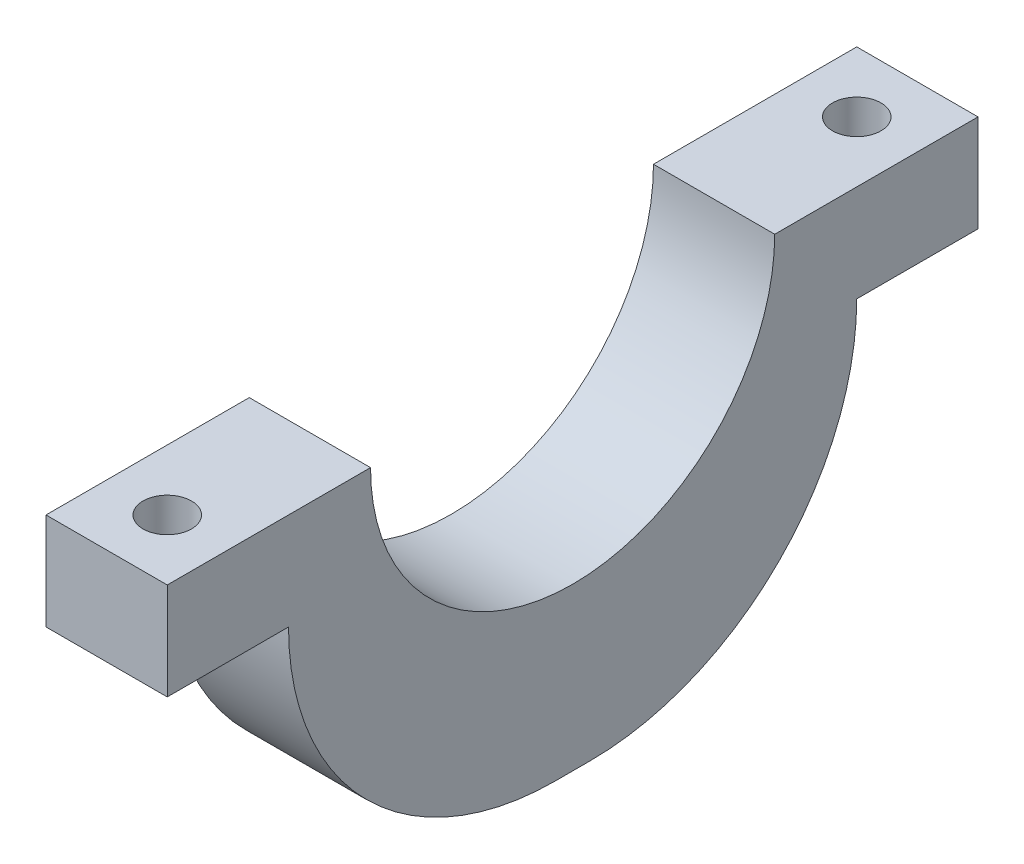
ISO-10303-21;
HEADER;
FILE_DESCRIPTION(('STEP AP214'),'2;1');
FILE_NAME('part.step','',(''),(''),'','','');
FILE_SCHEMA(('AUTOMOTIVE_DESIGN { 1 0 10303 214 1 1 1 1 }'));
ENDSEC;
DATA;
#1=APPLICATION_CONTEXT('core data for automotive mechanical design processes');
#2=APPLICATION_PROTOCOL_DEFINITION('international standard','automotive_design',2000,#1);
#3=PRODUCT_CONTEXT('',#1,'mechanical');
#4=PRODUCT('Part','Part','',(#3));
#5=PRODUCT_RELATED_PRODUCT_CATEGORY('part','',(#4));
#6=PRODUCT_DEFINITION_FORMATION('','',#4);
#7=PRODUCT_DEFINITION_CONTEXT('part definition',#1,'design');
#8=PRODUCT_DEFINITION('design','',#6,#7);
#9=PRODUCT_DEFINITION_SHAPE('','',#8);
#10=(LENGTH_UNIT() NAMED_UNIT(*) SI_UNIT(.MILLI.,.METRE.));
#11=(NAMED_UNIT(*) PLANE_ANGLE_UNIT() SI_UNIT($,.RADIAN.));
#12=(NAMED_UNIT(*) SI_UNIT($,.STERADIAN.) SOLID_ANGLE_UNIT());
#13=UNCERTAINTY_MEASURE_WITH_UNIT(LENGTH_MEASURE(1.E-05),#10,'distance_accuracy_value','');
#14=(GEOMETRIC_REPRESENTATION_CONTEXT(3) GLOBAL_UNCERTAINTY_ASSIGNED_CONTEXT((#13)) GLOBAL_UNIT_ASSIGNED_CONTEXT((#10,
#11,#12)) REPRESENTATION_CONTEXT('',''));
#15=CARTESIAN_POINT('',(0.,0.,0.));
#16=DIRECTION('',(0.,0.,1.));
#17=DIRECTION('',(1.,0.,0.));
#18=AXIS2_PLACEMENT_3D('',#15,#16,#17);
#19=CARTESIAN_POINT('',(0.,58.75,62.0524601018634));
#20=DIRECTION('',(1.,0.,0.));
#21=DIRECTION('',(0.,0.,-1.));
#22=AXIS2_PLACEMENT_3D('',#19,#20,#21);
#23=CYLINDRICAL_SURFACE('',#22,16.5);
#24=DIRECTION('',(1.,0.,0.));
#25=VECTOR('',#24,1.);
#26=CARTESIAN_POINT('',(0.,42.25,62.0524601018634));
#27=LINE('',#26,#25);
#28=CARTESIAN_POINT('',(-65.925,42.25,62.0524601018634));
#29=VERTEX_POINT('',#28);
#30=CARTESIAN_POINT('',(-58.425,42.25,62.0524601018634));
#31=VERTEX_POINT('',#30);
#32=EDGE_CURVE('E153',#29,#31,#27,.T.);
#33=ORIENTED_EDGE('',*,*,#32,.F.);
#34=CARTESIAN_POINT('',(-65.925,58.75,62.0524601018634));
#35=DIRECTION('',(-1.,0.,0.));
#36=DIRECTION('',(0.,0.,1.));
#37=AXIS2_PLACEMENT_3D('',#34,#35,#36);
#38=CIRCLE('',#37,16.5);
#39=CARTESIAN_POINT('',(-65.925,58.75,45.5524601018634));
#40=VERTEX_POINT('',#39);
#41=EDGE_CURVE('E43',#40,#29,#38,.T.);
#42=ORIENTED_EDGE('',*,*,#41,.F.);
#43=DIRECTION('',(1.,0.,0.));
#44=VECTOR('',#43,1.);
#45=CARTESIAN_POINT('',(0.,58.75,45.5524601018634));
#46=LINE('',#45,#44);
#47=CARTESIAN_POINT('',(-58.425,58.75,45.5524601018634));
#48=VERTEX_POINT('',#47);
#49=EDGE_CURVE('E117',#40,#48,#46,.T.);
#50=ORIENTED_EDGE('',*,*,#49,.T.);
#51=CARTESIAN_POINT('',(-58.425,58.75,62.0524601018634));
#52=DIRECTION('',(-1.,0.,0.));
#53=DIRECTION('',(0.,0.,1.));
#54=AXIS2_PLACEMENT_3D('',#51,#52,#53);
#55=CIRCLE('',#54,16.5);
#56=EDGE_CURVE('E11',#31,#48,#55,.F.);
#57=ORIENTED_EDGE('',*,*,#56,.F.);
#58=EDGE_LOOP('',(#33,#42,#50,#57));
#59=FACE_BOUND('',#58,.T.);
#60=ADVANCED_FACE('F36',(#59),#23,.T.);
#61=CARTESIAN_POINT('',(-65.925,58.75,64.1975398981366));
#62=DIRECTION('',(-1.,0.,0.));
#63=DIRECTION('',(0.,0.,1.));
#64=AXIS2_PLACEMENT_3D('',#61,#62,#63);
#65=CYLINDRICAL_SURFACE('',#64,16.5);
#66=DIRECTION('',(1.,0.,0.));
#67=VECTOR('',#66,1.);
#68=CARTESIAN_POINT('',(0.,58.75,80.6975398981366));
#69=LINE('',#68,#67);
#70=CARTESIAN_POINT('',(-65.925,58.75,80.6975398981366));
#71=VERTEX_POINT('',#70);
#72=CARTESIAN_POINT('',(-58.425,58.75,80.6975398981366));
#73=VERTEX_POINT('',#72);
#74=EDGE_CURVE('E169',#71,#73,#69,.T.);
#75=ORIENTED_EDGE('',*,*,#74,.F.);
#76=CARTESIAN_POINT('',(-65.925,58.75,64.1975398981366));
#77=DIRECTION('',(-1.,0.,0.));
#78=DIRECTION('',(0.,0.,1.));
#79=AXIS2_PLACEMENT_3D('',#76,#77,#78);
#80=CIRCLE('',#79,16.5);
#81=CARTESIAN_POINT('',(-65.925,42.25,64.1975398981366));
#82=VERTEX_POINT('',#81);
#83=EDGE_CURVE('E149',#82,#71,#80,.T.);
#84=ORIENTED_EDGE('',*,*,#83,.F.);
#85=DIRECTION('',(1.,0.,0.));
#86=VECTOR('',#85,1.);
#87=CARTESIAN_POINT('',(-65.925,42.25,64.1975398981366));
#88=LINE('',#87,#86);
#89=CARTESIAN_POINT('',(-58.425,42.25,64.1975398981366));
#90=VERTEX_POINT('',#89);
#91=EDGE_CURVE('E146',#90,#82,#88,.F.);
#92=ORIENTED_EDGE('',*,*,#91,.F.);
#93=CARTESIAN_POINT('',(-58.425,58.75,64.1975398981366));
#94=DIRECTION('',(-1.,0.,0.));
#95=DIRECTION('',(0.,0.,1.));
#96=AXIS2_PLACEMENT_3D('',#93,#94,#95);
#97=CIRCLE('',#96,16.5);
#98=EDGE_CURVE('E151',#73,#90,#97,.F.);
#99=ORIENTED_EDGE('',*,*,#98,.F.);
#100=EDGE_LOOP('',(#75,#84,#92,#99));
#101=FACE_BOUND('',#100,.T.);
#102=ADVANCED_FACE('F175',(#101),#65,.T.);
#103=CARTESIAN_POINT('',(-62.175,64.75,41.8024601018634));
#104=DIRECTION('',(0.,-1.,0.));
#105=DIRECTION('',(0.,0.,-1.));
#106=AXIS2_PLACEMENT_3D('',#103,#104,#105);
#107=CYLINDRICAL_SURFACE('',#106,1.5);
#108=CARTESIAN_POINT('',(-62.175,64.75,41.8024601018634));
#109=DIRECTION('',(0.,1.,0.));
#110=DIRECTION('',(0.,0.,1.));
#111=AXIS2_PLACEMENT_3D('',#108,#109,#110);
#112=CIRCLE('',#111,1.5);
#113=CARTESIAN_POINT('',(-62.175,64.75,43.3024601018634));
#114=VERTEX_POINT('',#113);
#115=EDGE_CURVE('E138',#114,#114,#112,.T.);
#116=ORIENTED_EDGE('',*,*,#115,.T.);
#117=EDGE_LOOP('',(#116));
#118=FACE_BOUND('',#117,.T.);
#119=CARTESIAN_POINT('',(-62.175,58.75,41.8024601018634));
#120=DIRECTION('',(0.,1.,0.));
#121=DIRECTION('',(0.,0.,1.));
#122=AXIS2_PLACEMENT_3D('',#119,#120,#121);
#123=CIRCLE('',#122,1.5);
#124=CARTESIAN_POINT('',(-62.175,58.75,43.3024601018634));
#125=VERTEX_POINT('',#124);
#126=EDGE_CURVE('E130',#125,#125,#123,.T.);
#127=ORIENTED_EDGE('',*,*,#126,.F.);
#128=EDGE_LOOP('',(#127));
#129=FACE_BOUND('',#128,.T.);
#130=ADVANCED_FACE('F247',(#118,#129),#107,.F.);
#131=CARTESIAN_POINT('',(-62.175,64.75,84.4475398981366));
#132=DIRECTION('',(0.,-1.,0.));
#133=DIRECTION('',(0.,0.,-1.));
#134=AXIS2_PLACEMENT_3D('',#131,#132,#133);
#135=CYLINDRICAL_SURFACE('',#134,1.5);
#136=CARTESIAN_POINT('',(-62.175,64.75,84.4475398981366));
#137=DIRECTION('',(0.,-1.,0.));
#138=DIRECTION('',(0.,0.,-1.));
#139=AXIS2_PLACEMENT_3D('',#136,#137,#138);
#140=CIRCLE('',#139,1.5);
#141=CARTESIAN_POINT('',(-62.175,64.75,82.9475398981366));
#142=VERTEX_POINT('',#141);
#143=EDGE_CURVE('E188',#142,#142,#140,.T.);
#144=ORIENTED_EDGE('',*,*,#143,.F.);
#145=EDGE_LOOP('',(#144));
#146=FACE_BOUND('',#145,.T.);
#147=CARTESIAN_POINT('',(-62.175,58.75,84.4475398981366));
#148=DIRECTION('',(0.,-1.,0.));
#149=DIRECTION('',(0.,0.,-1.));
#150=AXIS2_PLACEMENT_3D('',#147,#148,#149);
#151=CIRCLE('',#150,1.5);
#152=CARTESIAN_POINT('',(-62.175,58.75,82.9475398981366));
#153=VERTEX_POINT('',#152);
#154=EDGE_CURVE('E137',#153,#153,#151,.T.);
#155=ORIENTED_EDGE('',*,*,#154,.T.);
#156=EDGE_LOOP('',(#155));
#157=FACE_BOUND('',#156,.T.);
#158=ADVANCED_FACE('F239',(#146,#157),#135,.F.);
#159=CARTESIAN_POINT('',(0.,58.75,126.25));
#160=DIRECTION('',(0.,1.,0.));
#161=DIRECTION('',(0.,0.,-1.));
#162=AXIS2_PLACEMENT_3D('',#159,#160,#161);
#163=PLANE('',#162);
#164=ORIENTED_EDGE('',*,*,#126,.T.);
#165=EDGE_LOOP('',(#164));
#166=FACE_BOUND('',#165,.T.);
#167=DIRECTION('',(1.,0.,0.));
#168=VECTOR('',#167,1.);
#169=CARTESIAN_POINT('',(0.,58.75,38.0524601018634));
#170=LINE('',#169,#168);
#171=CARTESIAN_POINT('',(-65.925,58.75,38.0524601018634));
#172=VERTEX_POINT('',#171);
#173=CARTESIAN_POINT('',(-58.425,58.75,38.0524601018634));
#174=VERTEX_POINT('',#173);
#175=EDGE_CURVE('E124',#172,#174,#170,.T.);
#176=ORIENTED_EDGE('',*,*,#175,.T.);
#177=DIRECTION('',(0.,0.,1.));
#178=VECTOR('',#177,1.);
#179=CARTESIAN_POINT('',(-58.425,58.75,126.25));
#180=LINE('',#179,#178);
#181=EDGE_CURVE('E112',#174,#48,#180,.T.);
#182=ORIENTED_EDGE('',*,*,#181,.T.);
#183=ORIENTED_EDGE('',*,*,#49,.F.);
#184=DIRECTION('',(0.,0.,-1.));
#185=VECTOR('',#184,1.);
#186=CARTESIAN_POINT('',(-65.925,58.75,126.25));
#187=LINE('',#186,#185);
#188=EDGE_CURVE('E126',#40,#172,#187,.T.);
#189=ORIENTED_EDGE('',*,*,#188,.T.);
#190=EDGE_LOOP('',(#176,#182,#183,#189));
#191=FACE_BOUND('',#190,.T.);
#192=ADVANCED_FACE('F122',(#166,#191),#163,.F.);
#193=CARTESIAN_POINT('',(0.,58.75,38.0524601018634));
#194=DIRECTION('',(0.,0.,1.));
#195=DIRECTION('',(1.,0.,0.));
#196=AXIS2_PLACEMENT_3D('',#193,#194,#195);
#197=PLANE('',#196);
#198=DIRECTION('',(1.,0.,0.));
#199=VECTOR('',#198,1.);
#200=CARTESIAN_POINT('',(0.,64.75,38.0524601018634));
#201=LINE('',#200,#199);
#202=CARTESIAN_POINT('',(-65.925,64.75,38.0524601018634));
#203=VERTEX_POINT('',#202);
#204=CARTESIAN_POINT('',(-58.425,64.75,38.0524601018634));
#205=VERTEX_POINT('',#204);
#206=EDGE_CURVE('E128',#203,#205,#201,.T.);
#207=ORIENTED_EDGE('',*,*,#206,.T.);
#208=DIRECTION('',(0.,1.,0.));
#209=VECTOR('',#208,1.);
#210=CARTESIAN_POINT('',(-58.425,58.75,38.0524601018634));
#211=LINE('',#210,#209);
#212=EDGE_CURVE('E142',#174,#205,#211,.T.);
#213=ORIENTED_EDGE('',*,*,#212,.F.);
#214=ORIENTED_EDGE('',*,*,#175,.F.);
#215=DIRECTION('',(0.,1.,0.));
#216=VECTOR('',#215,1.);
#217=CARTESIAN_POINT('',(-65.925,58.75,38.0524601018634));
#218=LINE('',#217,#216);
#219=EDGE_CURVE('E193',#172,#203,#218,.T.);
#220=ORIENTED_EDGE('',*,*,#219,.T.);
#221=EDGE_LOOP('',(#207,#213,#214,#220));
#222=FACE_BOUND('',#221,.T.);
#223=ADVANCED_FACE('F230',(#222),#197,.F.);
#224=CARTESIAN_POINT('',(0.,64.75,0.));
#225=DIRECTION('',(0.,-1.,0.));
#226=DIRECTION('',(0.,0.,1.));
#227=AXIS2_PLACEMENT_3D('',#224,#225,#226);
#228=PLANE('',#227);
#229=ORIENTED_EDGE('',*,*,#115,.F.);
#230=EDGE_LOOP('',(#229));
#231=FACE_BOUND('',#230,.T.);
#232=DIRECTION('',(0.,0.,-1.));
#233=VECTOR('',#232,1.);
#234=CARTESIAN_POINT('',(-58.425,64.75,53.125));
#235=LINE('',#234,#233);
#236=CARTESIAN_POINT('',(-58.425,64.75,50.625));
#237=VERTEX_POINT('',#236);
#238=EDGE_CURVE('E195',#237,#205,#235,.T.);
#239=ORIENTED_EDGE('',*,*,#238,.T.);
#240=ORIENTED_EDGE('',*,*,#206,.F.);
#241=DIRECTION('',(0.,0.,1.));
#242=VECTOR('',#241,1.);
#243=CARTESIAN_POINT('',(-65.925,64.75,53.125));
#244=LINE('',#243,#242);
#245=CARTESIAN_POINT('',(-65.925,64.75,50.625));
#246=VERTEX_POINT('',#245);
#247=EDGE_CURVE('E205',#203,#246,#244,.T.);
#248=ORIENTED_EDGE('',*,*,#247,.T.);
#249=DIRECTION('',(1.,0.,0.));
#250=VECTOR('',#249,1.);
#251=CARTESIAN_POINT('',(-70.925,64.75,50.625));
#252=LINE('',#251,#250);
#253=EDGE_CURVE('E192',#237,#246,#252,.F.);
#254=ORIENTED_EDGE('',*,*,#253,.F.);
#255=EDGE_LOOP('',(#239,#240,#248,#254));
#256=FACE_BOUND('',#255,.T.);
#257=ADVANCED_FACE('F226',(#231,#256),#228,.F.);
#258=CARTESIAN_POINT('',(-70.925,64.75,63.125));
#259=DIRECTION('',(1.,0.,0.));
#260=DIRECTION('',(0.,0.,-1.));
#261=AXIS2_PLACEMENT_3D('',#258,#259,#260);
#262=CYLINDRICAL_SURFACE('',#261,12.5);
#263=DIRECTION('',(1.,0.,0.));
#264=VECTOR('',#263,1.);
#265=CARTESIAN_POINT('',(-70.925,64.75,75.625));
#266=LINE('',#265,#264);
#267=CARTESIAN_POINT('',(-65.925,64.75,75.625));
#268=VERTEX_POINT('',#267);
#269=CARTESIAN_POINT('',(-58.425,64.75,75.625));
#270=VERTEX_POINT('',#269);
#271=EDGE_CURVE('E208',#268,#270,#266,.T.);
#272=ORIENTED_EDGE('',*,*,#271,.T.);
#273=CARTESIAN_POINT('',(-58.425,64.75,63.125));
#274=DIRECTION('',(-1.,0.,0.));
#275=DIRECTION('',(0.,0.,1.));
#276=AXIS2_PLACEMENT_3D('',#273,#274,#275);
#277=CIRCLE('',#276,12.5);
#278=EDGE_CURVE('E183',#237,#270,#277,.T.);
#279=ORIENTED_EDGE('',*,*,#278,.F.);
#280=ORIENTED_EDGE('',*,*,#253,.T.);
#281=CARTESIAN_POINT('',(-65.925,64.75,63.125));
#282=DIRECTION('',(-1.,0.,0.));
#283=DIRECTION('',(0.,0.,1.));
#284=AXIS2_PLACEMENT_3D('',#281,#282,#283);
#285=CIRCLE('',#284,12.5);
#286=EDGE_CURVE('E143',#268,#246,#285,.F.);
#287=ORIENTED_EDGE('',*,*,#286,.F.);
#288=EDGE_LOOP('',(#272,#279,#280,#287));
#289=FACE_BOUND('',#288,.T.);
#290=ADVANCED_FACE('F224',(#289),#262,.F.);
#291=ORIENTED_EDGE('',*,*,#143,.T.);
#292=EDGE_LOOP('',(#291));
#293=FACE_BOUND('',#292,.T.);
#294=DIRECTION('',(0.,0.,1.));
#295=VECTOR('',#294,1.);
#296=CARTESIAN_POINT('',(-65.925,64.75,73.125));
#297=LINE('',#296,#295);
#298=CARTESIAN_POINT('',(-65.925,64.75,88.1975398981366));
#299=VERTEX_POINT('',#298);
#300=EDGE_CURVE('E191',#268,#299,#297,.T.);
#301=ORIENTED_EDGE('',*,*,#300,.T.);
#302=DIRECTION('',(1.,0.,0.));
#303=VECTOR('',#302,1.);
#304=CARTESIAN_POINT('',(0.,64.75,88.1975398981366));
#305=LINE('',#304,#303);
#306=CARTESIAN_POINT('',(-58.425,64.75,88.1975398981366));
#307=VERTEX_POINT('',#306);
#308=EDGE_CURVE('E204',#299,#307,#305,.T.);
#309=ORIENTED_EDGE('',*,*,#308,.T.);
#310=DIRECTION('',(0.,0.,-1.));
#311=VECTOR('',#310,1.);
#312=CARTESIAN_POINT('',(-58.425,64.75,73.125));
#313=LINE('',#312,#311);
#314=EDGE_CURVE('E185',#307,#270,#313,.T.);
#315=ORIENTED_EDGE('',*,*,#314,.T.);
#316=ORIENTED_EDGE('',*,*,#271,.F.);
#317=EDGE_LOOP('',(#301,#309,#315,#316));
#318=FACE_BOUND('',#317,.T.);
#319=ADVANCED_FACE('F214',(#293,#318),#228,.F.);
#320=CARTESIAN_POINT('',(0.,58.75,88.1975398981366));
#321=DIRECTION('',(0.,0.,1.));
#322=DIRECTION('',(1.,0.,0.));
#323=AXIS2_PLACEMENT_3D('',#320,#321,#322);
#324=PLANE('',#323);
#325=ORIENTED_EDGE('',*,*,#308,.F.);
#326=DIRECTION('',(0.,1.,0.));
#327=VECTOR('',#326,1.);
#328=CARTESIAN_POINT('',(-65.925,58.75,88.1975398981366));
#329=LINE('',#328,#327);
#330=CARTESIAN_POINT('',(-65.925,58.75,88.1975398981366));
#331=VERTEX_POINT('',#330);
#332=EDGE_CURVE('E173',#331,#299,#329,.T.);
#333=ORIENTED_EDGE('',*,*,#332,.F.);
#334=DIRECTION('',(1.,0.,0.));
#335=VECTOR('',#334,1.);
#336=CARTESIAN_POINT('',(0.,58.75,88.1975398981366));
#337=LINE('',#336,#335);
#338=CARTESIAN_POINT('',(-58.425,58.75,88.1975398981366));
#339=VERTEX_POINT('',#338);
#340=EDGE_CURVE('E172',#331,#339,#337,.T.);
#341=ORIENTED_EDGE('',*,*,#340,.T.);
#342=DIRECTION('',(0.,1.,0.));
#343=VECTOR('',#342,1.);
#344=CARTESIAN_POINT('',(-58.425,58.75,88.1975398981366));
#345=LINE('',#344,#343);
#346=EDGE_CURVE('E176',#339,#307,#345,.T.);
#347=ORIENTED_EDGE('',*,*,#346,.T.);
#348=EDGE_LOOP('',(#325,#333,#341,#347));
#349=FACE_BOUND('',#348,.T.);
#350=ADVANCED_FACE('F219',(#349),#324,.T.);
#351=CARTESIAN_POINT('',(0.,58.75,0.));
#352=DIRECTION('',(0.,1.,0.));
#353=DIRECTION('',(0.,0.,1.));
#354=AXIS2_PLACEMENT_3D('',#351,#352,#353);
#355=PLANE('',#354);
#356=ORIENTED_EDGE('',*,*,#154,.F.);
#357=EDGE_LOOP('',(#356));
#358=FACE_BOUND('',#357,.T.);
#359=ORIENTED_EDGE('',*,*,#340,.F.);
#360=DIRECTION('',(0.,0.,1.));
#361=VECTOR('',#360,1.);
#362=CARTESIAN_POINT('',(-65.925,58.75,0.));
#363=LINE('',#362,#361);
#364=EDGE_CURVE('E161',#71,#331,#363,.T.);
#365=ORIENTED_EDGE('',*,*,#364,.F.);
#366=ORIENTED_EDGE('',*,*,#74,.T.);
#367=DIRECTION('',(0.,0.,-1.));
#368=VECTOR('',#367,1.);
#369=CARTESIAN_POINT('',(-58.425,58.75,0.));
#370=LINE('',#369,#368);
#371=EDGE_CURVE('E120',#339,#73,#370,.T.);
#372=ORIENTED_EDGE('',*,*,#371,.F.);
#373=EDGE_LOOP('',(#359,#365,#366,#372));
#374=FACE_BOUND('',#373,.T.);
#375=ADVANCED_FACE('F167',(#358,#374),#355,.F.);
#376=CARTESIAN_POINT('',(-65.925,-35.9364248901641,45.5524601018634));
#377=DIRECTION('',(-1.,0.,0.));
#378=DIRECTION('',(0.,0.,1.));
#379=AXIS2_PLACEMENT_3D('',#376,#377,#378);
#380=PLANE('',#379);
#381=ORIENTED_EDGE('',*,*,#188,.F.);
#382=ORIENTED_EDGE('',*,*,#41,.T.);
#383=DIRECTION('',(0.,0.,-1.));
#384=VECTOR('',#383,1.);
#385=CARTESIAN_POINT('',(-65.925,42.25,45.5524601018634));
#386=LINE('',#385,#384);
#387=EDGE_CURVE('E119',#82,#29,#386,.T.);
#388=ORIENTED_EDGE('',*,*,#387,.F.);
#389=ORIENTED_EDGE('',*,*,#83,.T.);
#390=ORIENTED_EDGE('',*,*,#364,.T.);
#391=ORIENTED_EDGE('',*,*,#332,.T.);
#392=ORIENTED_EDGE('',*,*,#300,.F.);
#393=ORIENTED_EDGE('',*,*,#286,.T.);
#394=ORIENTED_EDGE('',*,*,#247,.F.);
#395=ORIENTED_EDGE('',*,*,#219,.F.);
#396=EDGE_LOOP('',(#381,#382,#388,#389,#390,#391,#392,#393,#394,#395));
#397=FACE_BOUND('',#396,.T.);
#398=ADVANCED_FACE('F157',(#397),#380,.T.);
#399=CARTESIAN_POINT('',(-58.425,-35.9364248901641,45.5524601018634));
#400=DIRECTION('',(-1.,0.,0.));
#401=DIRECTION('',(0.,0.,1.));
#402=AXIS2_PLACEMENT_3D('',#399,#400,#401);
#403=PLANE('',#402);
#404=DIRECTION('',(0.,0.,-1.));
#405=VECTOR('',#404,1.);
#406=CARTESIAN_POINT('',(-58.425,42.25,45.5524601018634));
#407=LINE('',#406,#405);
#408=EDGE_CURVE('E115',#90,#31,#407,.T.);
#409=ORIENTED_EDGE('',*,*,#408,.T.);
#410=ORIENTED_EDGE('',*,*,#56,.T.);
#411=ORIENTED_EDGE('',*,*,#181,.F.);
#412=ORIENTED_EDGE('',*,*,#212,.T.);
#413=ORIENTED_EDGE('',*,*,#238,.F.);
#414=ORIENTED_EDGE('',*,*,#278,.T.);
#415=ORIENTED_EDGE('',*,*,#314,.F.);
#416=ORIENTED_EDGE('',*,*,#346,.F.);
#417=ORIENTED_EDGE('',*,*,#371,.T.);
#418=ORIENTED_EDGE('',*,*,#98,.T.);
#419=EDGE_LOOP('',(#409,#410,#411,#412,#413,#414,#415,#416,#417,#418));
#420=FACE_BOUND('',#419,.T.);
#421=ADVANCED_FACE('F109',(#420),#403,.F.);
#422=CARTESIAN_POINT('',(0.,42.25,0.));
#423=DIRECTION('',(0.,1.,0.));
#424=DIRECTION('',(0.,0.,1.));
#425=AXIS2_PLACEMENT_3D('',#422,#423,#424);
#426=PLANE('',#425);
#427=ORIENTED_EDGE('',*,*,#387,.T.);
#428=ORIENTED_EDGE('',*,*,#32,.T.);
#429=ORIENTED_EDGE('',*,*,#408,.F.);
#430=ORIENTED_EDGE('',*,*,#91,.T.);
#431=EDGE_LOOP('',(#427,#428,#429,#430));
#432=FACE_BOUND('',#431,.T.);
#433=ADVANCED_FACE('F155',(#432),#426,.F.);
#434=CLOSED_SHELL('',(#60,#102,#130,#158,#192,#223,#257,#290,#319,#350,#375,#398,#421,#433));
#435=MANIFOLD_SOLID_BREP('B2',#434);
#436=ADVANCED_BREP_SHAPE_REPRESENTATION('',(#18,#435),#14);
#437=SHAPE_DEFINITION_REPRESENTATION(#9,#436);
ENDSEC;
END-ISO-10303-21;
